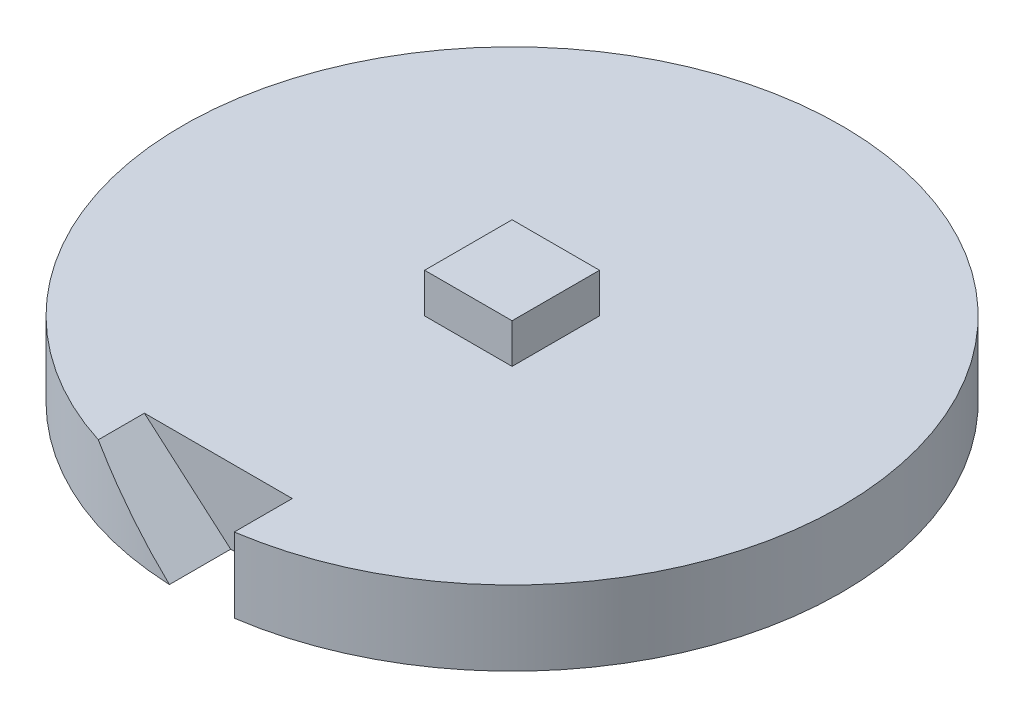
ISO-10303-21;
HEADER;
FILE_DESCRIPTION(('STEP AP214'),'2;1');
FILE_NAME('part.step','',(''),(''),'','','');
FILE_SCHEMA(('AUTOMOTIVE_DESIGN { 1 0 10303 214 1 1 1 1 }'));
ENDSEC;
DATA;
#1=APPLICATION_CONTEXT('core data for automotive mechanical design processes');
#2=APPLICATION_PROTOCOL_DEFINITION('international standard','automotive_design',2000,#1);
#3=PRODUCT_CONTEXT('',#1,'mechanical');
#4=PRODUCT('Part','Part','',(#3));
#5=PRODUCT_RELATED_PRODUCT_CATEGORY('part','',(#4));
#6=PRODUCT_DEFINITION_FORMATION('','',#4);
#7=PRODUCT_DEFINITION_CONTEXT('part definition',#1,'design');
#8=PRODUCT_DEFINITION('design','',#6,#7);
#9=PRODUCT_DEFINITION_SHAPE('','',#8);
#10=(LENGTH_UNIT() NAMED_UNIT(*) SI_UNIT(.MILLI.,.METRE.));
#11=(NAMED_UNIT(*) PLANE_ANGLE_UNIT() SI_UNIT($,.RADIAN.));
#12=(NAMED_UNIT(*) SI_UNIT($,.STERADIAN.) SOLID_ANGLE_UNIT());
#13=UNCERTAINTY_MEASURE_WITH_UNIT(LENGTH_MEASURE(1.E-05),#10,'distance_accuracy_value','');
#14=(GEOMETRIC_REPRESENTATION_CONTEXT(3) GLOBAL_UNCERTAINTY_ASSIGNED_CONTEXT((#13)) GLOBAL_UNIT_ASSIGNED_CONTEXT((#10,
#11,#12)) REPRESENTATION_CONTEXT('',''));
#15=CARTESIAN_POINT('',(0.,0.,0.));
#16=DIRECTION('',(0.,0.,1.));
#17=DIRECTION('',(1.,0.,0.));
#18=AXIS2_PLACEMENT_3D('',#15,#16,#17);
#19=CARTESIAN_POINT('',(0.,8.5,0.));
#20=DIRECTION('',(0.,1.,0.));
#21=DIRECTION('',(0.,0.,1.));
#22=AXIS2_PLACEMENT_3D('',#19,#20,#21);
#23=PLANE('',#22);
#24=DIRECTION('',(0.,0.,1.));
#25=VECTOR('',#24,1.);
#26=CARTESIAN_POINT('',(-11.3352998065365,8.5,30.5));
#27=LINE('',#26,#25);
#28=CARTESIAN_POINT('',(-11.3352998065365,8.5,30.5));
#29=VERTEX_POINT('',#28);
#30=CARTESIAN_POINT('',(-11.3352998065365,8.5,35.7457826644757));
#31=VERTEX_POINT('',#30);
#32=EDGE_CURVE('E142',#29,#31,#27,.T.);
#33=ORIENTED_EDGE('',*,*,#32,.F.);
#34=DIRECTION('',(-1.,0.,0.));
#35=VECTOR('',#34,1.);
#36=CARTESIAN_POINT('',(5.48783229101683,8.5,30.5));
#37=LINE('',#36,#35);
#38=CARTESIAN_POINT('',(5.48783229101683,8.5,30.5));
#39=VERTEX_POINT('',#38);
#40=EDGE_CURVE('E126',#39,#29,#37,.T.);
#41=ORIENTED_EDGE('',*,*,#40,.F.);
#42=DIRECTION('',(0.,0.,1.));
#43=VECTOR('',#42,1.);
#44=CARTESIAN_POINT('',(5.48783229101683,8.5,30.5));
#45=LINE('',#44,#43);
#46=CARTESIAN_POINT('',(5.48783229101683,8.5,37.0962760495669));
#47=VERTEX_POINT('',#46);
#48=EDGE_CURVE('E134',#39,#47,#45,.T.);
#49=ORIENTED_EDGE('',*,*,#48,.T.);
#50=CARTESIAN_POINT('',(0.,8.5,0.));
#51=DIRECTION('',(0.,1.,0.));
#52=DIRECTION('',(0.,0.,1.));
#53=AXIS2_PLACEMENT_3D('',#50,#51,#52);
#54=CIRCLE('',#53,37.5);
#55=EDGE_CURVE('E227',#47,#31,#54,.T.);
#56=ORIENTED_EDGE('',*,*,#55,.T.);
#57=EDGE_LOOP('',(#33,#41,#49,#56));
#58=FACE_BOUND('',#57,.T.);
#59=DIRECTION('',(1.,0.,0.));
#60=VECTOR('',#59,1.);
#61=CARTESIAN_POINT('',(0.,8.5,-4.975));
#62=LINE('',#61,#60);
#63=CARTESIAN_POINT('',(-4.975,8.5,-4.975));
#64=VERTEX_POINT('',#63);
#65=CARTESIAN_POINT('',(4.975,8.5,-4.975));
#66=VERTEX_POINT('',#65);
#67=EDGE_CURVE('E218',#64,#66,#62,.T.);
#68=ORIENTED_EDGE('',*,*,#67,.T.);
#69=DIRECTION('',(0.,0.,1.));
#70=VECTOR('',#69,1.);
#71=CARTESIAN_POINT('',(4.975,8.5,0.));
#72=LINE('',#71,#70);
#73=CARTESIAN_POINT('',(4.975,8.5,4.975));
#74=VERTEX_POINT('',#73);
#75=EDGE_CURVE('E222',#66,#74,#72,.T.);
#76=ORIENTED_EDGE('',*,*,#75,.T.);
#77=DIRECTION('',(-1.,0.,0.));
#78=VECTOR('',#77,1.);
#79=CARTESIAN_POINT('',(0.,8.5,4.975));
#80=LINE('',#79,#78);
#81=CARTESIAN_POINT('',(-4.975,8.5,4.975));
#82=VERTEX_POINT('',#81);
#83=EDGE_CURVE('E210',#74,#82,#80,.T.);
#84=ORIENTED_EDGE('',*,*,#83,.T.);
#85=DIRECTION('',(0.,0.,-1.));
#86=VECTOR('',#85,1.);
#87=CARTESIAN_POINT('',(-4.975,8.5,0.));
#88=LINE('',#87,#86);
#89=EDGE_CURVE('E214',#82,#64,#88,.T.);
#90=ORIENTED_EDGE('',*,*,#89,.T.);
#91=EDGE_LOOP('',(#68,#76,#84,#90));
#92=FACE_BOUND('',#91,.T.);
#93=ADVANCED_FACE('F45',(#58,#92),#23,.T.);
#94=CARTESIAN_POINT('',(0.,8.5,0.));
#95=DIRECTION('',(0.,-1.,0.));
#96=DIRECTION('',(0.,0.,-1.));
#97=AXIS2_PLACEMENT_3D('',#94,#95,#96);
#98=CYLINDRICAL_SURFACE('',#97,37.5);
#99=CARTESIAN_POINT('',(0.,0.,0.));
#100=DIRECTION('',(0.,1.,0.));
#101=DIRECTION('',(0.,0.,1.));
#102=AXIS2_PLACEMENT_3D('',#99,#100,#101);
#103=CIRCLE('',#102,37.5);
#104=CARTESIAN_POINT('',(5.48783229101683,0.,37.0962760495669));
#105=VERTEX_POINT('',#104);
#106=CARTESIAN_POINT('',(-1.51899802399232,0.,37.4692226367603));
#107=VERTEX_POINT('',#106);
#108=EDGE_CURVE('E226',#105,#107,#103,.T.);
#109=ORIENTED_EDGE('',*,*,#108,.T.);
#110=CARTESIAN_POINT('',(0.,-1.315310336821,0.));
#111=DIRECTION('',(-0.654602325716553,-0.755973409033995,0.));
#112=DIRECTION('',(0.755973409033995,-0.654602325716553,0.));
#113=AXIS2_PLACEMENT_3D('',#110,#111,#112);
#114=ELLIPSE('',#113,49.6049193686834,37.5);
#115=EDGE_CURVE('E155',#107,#31,#114,.T.);
#116=ORIENTED_EDGE('',*,*,#115,.T.);
#117=ORIENTED_EDGE('',*,*,#55,.F.);
#118=DIRECTION('',(0.,-1.,0.));
#119=VECTOR('',#118,1.);
#120=CARTESIAN_POINT('',(5.48783229101683,8.5,37.0962760495669));
#121=LINE('',#120,#119);
#122=EDGE_CURVE('E137',#47,#105,#121,.T.);
#123=ORIENTED_EDGE('',*,*,#122,.T.);
#124=EDGE_LOOP('',(#109,#116,#117,#123));
#125=FACE_BOUND('',#124,.T.);
#126=ADVANCED_FACE('F47',(#125),#98,.T.);
#127=CARTESIAN_POINT('',(0.,0.,0.));
#128=DIRECTION('',(0.,1.,0.));
#129=DIRECTION('',(0.,0.,1.));
#130=AXIS2_PLACEMENT_3D('',#127,#128,#129);
#131=PLANE('',#130);
#132=CARTESIAN_POINT('',(0.,0.,0.));
#133=DIRECTION('',(0.,1.,0.));
#134=DIRECTION('',(0.,0.,1.));
#135=AXIS2_PLACEMENT_3D('',#132,#133,#134);
#136=CIRCLE('',#135,5.);
#137=CARTESIAN_POINT('',(0.,0.,5.));
#138=VERTEX_POINT('',#137);
#139=EDGE_CURVE('E230',#138,#138,#136,.F.);
#140=ORIENTED_EDGE('',*,*,#139,.F.);
#141=EDGE_LOOP('',(#140));
#142=FACE_BOUND('',#141,.T.);
#143=DIRECTION('',(1.,0.,0.));
#144=VECTOR('',#143,1.);
#145=CARTESIAN_POINT('',(0.,0.,30.5));
#146=LINE('',#145,#144);
#147=CARTESIAN_POINT('',(-1.51899802399232,0.,30.5));
#148=VERTEX_POINT('',#147);
#149=CARTESIAN_POINT('',(5.48783229101683,0.,30.5));
#150=VERTEX_POINT('',#149);
#151=EDGE_CURVE('E128',#148,#150,#146,.T.);
#152=ORIENTED_EDGE('',*,*,#151,.F.);
#153=DIRECTION('',(0.,0.,1.));
#154=VECTOR('',#153,1.);
#155=CARTESIAN_POINT('',(-1.51899802399232,0.,0.));
#156=LINE('',#155,#154);
#157=EDGE_CURVE('E11',#148,#107,#156,.T.);
#158=ORIENTED_EDGE('',*,*,#157,.T.);
#159=ORIENTED_EDGE('',*,*,#108,.F.);
#160=DIRECTION('',(0.,0.,-1.));
#161=VECTOR('',#160,1.);
#162=CARTESIAN_POINT('',(5.48783229101683,0.,0.));
#163=LINE('',#162,#161);
#164=EDGE_CURVE('E54',#105,#150,#163,.T.);
#165=ORIENTED_EDGE('',*,*,#164,.T.);
#166=EDGE_LOOP('',(#152,#158,#159,#165));
#167=FACE_BOUND('',#166,.T.);
#168=ADVANCED_FACE('F241',(#142,#167),#131,.F.);
#169=CARTESIAN_POINT('',(4.975,13.,-4.975));
#170=DIRECTION('',(-1.,0.,0.));
#171=DIRECTION('',(0.,0.,1.));
#172=AXIS2_PLACEMENT_3D('',#169,#170,#171);
#173=PLANE('',#172);
#174=ORIENTED_EDGE('',*,*,#75,.F.);
#175=DIRECTION('',(0.,-1.,0.));
#176=VECTOR('',#175,1.);
#177=CARTESIAN_POINT('',(4.975,13.,-4.975));
#178=LINE('',#177,#176);
#179=CARTESIAN_POINT('',(4.975,13.,-4.975));
#180=VERTEX_POINT('',#179);
#181=EDGE_CURVE('E206',#180,#66,#178,.T.);
#182=ORIENTED_EDGE('',*,*,#181,.F.);
#183=DIRECTION('',(0.,0.,-1.));
#184=VECTOR('',#183,1.);
#185=CARTESIAN_POINT('',(4.975,13.,-4.975));
#186=LINE('',#185,#184);
#187=CARTESIAN_POINT('',(4.975,13.,4.975));
#188=VERTEX_POINT('',#187);
#189=EDGE_CURVE('E182',#188,#180,#186,.T.);
#190=ORIENTED_EDGE('',*,*,#189,.F.);
#191=DIRECTION('',(0.,-1.,0.));
#192=VECTOR('',#191,1.);
#193=CARTESIAN_POINT('',(4.975,13.,4.975));
#194=LINE('',#193,#192);
#195=EDGE_CURVE('E195',#188,#74,#194,.T.);
#196=ORIENTED_EDGE('',*,*,#195,.T.);
#197=EDGE_LOOP('',(#174,#182,#190,#196));
#198=FACE_BOUND('',#197,.T.);
#199=ADVANCED_FACE('F264',(#198),#173,.F.);
#200=CARTESIAN_POINT('',(-4.975,13.,-4.975));
#201=DIRECTION('',(0.,0.,1.));
#202=DIRECTION('',(1.,0.,0.));
#203=AXIS2_PLACEMENT_3D('',#200,#201,#202);
#204=PLANE('',#203);
#205=ORIENTED_EDGE('',*,*,#67,.F.);
#206=DIRECTION('',(0.,-1.,0.));
#207=VECTOR('',#206,1.);
#208=CARTESIAN_POINT('',(-4.975,13.,-4.975));
#209=LINE('',#208,#207);
#210=CARTESIAN_POINT('',(-4.975,13.,-4.975));
#211=VERTEX_POINT('',#210);
#212=EDGE_CURVE('E202',#211,#64,#209,.T.);
#213=ORIENTED_EDGE('',*,*,#212,.F.);
#214=DIRECTION('',(-1.,0.,0.));
#215=VECTOR('',#214,1.);
#216=CARTESIAN_POINT('',(-4.975,13.,-4.975));
#217=LINE('',#216,#215);
#218=EDGE_CURVE('E186',#180,#211,#217,.T.);
#219=ORIENTED_EDGE('',*,*,#218,.F.);
#220=ORIENTED_EDGE('',*,*,#181,.T.);
#221=EDGE_LOOP('',(#205,#213,#219,#220));
#222=FACE_BOUND('',#221,.T.);
#223=ADVANCED_FACE('F270',(#222),#204,.F.);
#224=CARTESIAN_POINT('',(-4.975,13.,-4.975));
#225=DIRECTION('',(1.,0.,0.));
#226=DIRECTION('',(0.,0.,-1.));
#227=AXIS2_PLACEMENT_3D('',#224,#225,#226);
#228=PLANE('',#227);
#229=ORIENTED_EDGE('',*,*,#89,.F.);
#230=DIRECTION('',(0.,-1.,0.));
#231=VECTOR('',#230,1.);
#232=CARTESIAN_POINT('',(-4.975,13.,4.975));
#233=LINE('',#232,#231);
#234=CARTESIAN_POINT('',(-4.975,13.,4.975));
#235=VERTEX_POINT('',#234);
#236=EDGE_CURVE('E199',#235,#82,#233,.T.);
#237=ORIENTED_EDGE('',*,*,#236,.F.);
#238=DIRECTION('',(0.,0.,1.));
#239=VECTOR('',#238,1.);
#240=CARTESIAN_POINT('',(-4.975,13.,-4.975));
#241=LINE('',#240,#239);
#242=EDGE_CURVE('E189',#211,#235,#241,.T.);
#243=ORIENTED_EDGE('',*,*,#242,.F.);
#244=ORIENTED_EDGE('',*,*,#212,.T.);
#245=EDGE_LOOP('',(#229,#237,#243,#244));
#246=FACE_BOUND('',#245,.T.);
#247=ADVANCED_FACE('F295',(#246),#228,.F.);
#248=CARTESIAN_POINT('',(-4.975,13.,4.975));
#249=DIRECTION('',(0.,0.,-1.));
#250=DIRECTION('',(-1.,0.,0.));
#251=AXIS2_PLACEMENT_3D('',#248,#249,#250);
#252=PLANE('',#251);
#253=ORIENTED_EDGE('',*,*,#83,.F.);
#254=ORIENTED_EDGE('',*,*,#195,.F.);
#255=DIRECTION('',(1.,0.,0.));
#256=VECTOR('',#255,1.);
#257=CARTESIAN_POINT('',(-4.975,13.,4.975));
#258=LINE('',#257,#256);
#259=EDGE_CURVE('E192',#235,#188,#258,.T.);
#260=ORIENTED_EDGE('',*,*,#259,.F.);
#261=ORIENTED_EDGE('',*,*,#236,.T.);
#262=EDGE_LOOP('',(#253,#254,#260,#261));
#263=FACE_BOUND('',#262,.T.);
#264=ADVANCED_FACE('F287',(#263),#252,.F.);
#265=CARTESIAN_POINT('',(0.,13.,0.));
#266=DIRECTION('',(0.,1.,0.));
#267=DIRECTION('',(0.,0.,1.));
#268=AXIS2_PLACEMENT_3D('',#265,#266,#267);
#269=PLANE('',#268);
#270=ORIENTED_EDGE('',*,*,#189,.T.);
#271=ORIENTED_EDGE('',*,*,#218,.T.);
#272=ORIENTED_EDGE('',*,*,#242,.T.);
#273=ORIENTED_EDGE('',*,*,#259,.T.);
#274=EDGE_LOOP('',(#270,#271,#272,#273));
#275=FACE_BOUND('',#274,.T.);
#276=ADVANCED_FACE('F277',(#275),#269,.T.);
#277=CARTESIAN_POINT('',(0.,-10.,0.));
#278=DIRECTION('',(0.,1.,0.));
#279=DIRECTION('',(0.,0.,1.));
#280=AXIS2_PLACEMENT_3D('',#277,#278,#279);
#281=CYLINDRICAL_SURFACE('',#280,5.);
#282=CARTESIAN_POINT('',(0.,-10.,0.));
#283=DIRECTION('',(0.,-1.,0.));
#284=DIRECTION('',(0.,0.,-1.));
#285=AXIS2_PLACEMENT_3D('',#282,#283,#284);
#286=CIRCLE('',#285,5.);
#287=CARTESIAN_POINT('',(0.,-10.,-5.));
#288=VERTEX_POINT('',#287);
#289=EDGE_CURVE('E178',#288,#288,#286,.T.);
#290=ORIENTED_EDGE('',*,*,#289,.F.);
#291=EDGE_LOOP('',(#290));
#292=FACE_BOUND('',#291,.T.);
#293=ORIENTED_EDGE('',*,*,#139,.T.);
#294=EDGE_LOOP('',(#293));
#295=FACE_BOUND('',#294,.T.);
#296=ADVANCED_FACE('F274',(#292,#295),#281,.T.);
#297=CARTESIAN_POINT('',(0.,-10.,0.));
#298=DIRECTION('',(0.,-1.,0.));
#299=DIRECTION('',(0.,0.,-1.));
#300=AXIS2_PLACEMENT_3D('',#297,#298,#299);
#301=PLANE('',#300);
#302=CARTESIAN_POINT('',(0.0180115311504414,-10.,0.00676759727533257));
#303=DIRECTION('',(0.,-1.,0.));
#304=DIRECTION('',(0.,0.,-1.));
#305=AXIS2_PLACEMENT_3D('',#302,#303,#304);
#306=CIRCLE('',#305,1.55);
#307=CARTESIAN_POINT('',(0.565734088655607,-10.,-1.44323240272467));
#308=VERTEX_POINT('',#307);
#309=CARTESIAN_POINT('',(-0.529711026354725,-10.,-1.44323240272467));
#310=VERTEX_POINT('',#309);
#311=EDGE_CURVE('E69',#308,#310,#306,.T.);
#312=ORIENTED_EDGE('',*,*,#311,.F.);
#313=DIRECTION('',(1.,0.,0.));
#314=VECTOR('',#313,1.);
#315=CARTESIAN_POINT('',(0.0180115311504414,-10.,-1.44323240272467));
#316=LINE('',#315,#314);
#317=EDGE_CURVE('E163',#310,#308,#316,.T.);
#318=ORIENTED_EDGE('',*,*,#317,.F.);
#319=EDGE_LOOP('',(#312,#318));
#320=FACE_BOUND('',#319,.T.);
#321=ORIENTED_EDGE('',*,*,#289,.T.);
#322=EDGE_LOOP('',(#321));
#323=FACE_BOUND('',#322,.T.);
#324=ADVANCED_FACE('F276',(#320,#323),#301,.T.);
#325=CARTESIAN_POINT('',(0.0180115311504414,0.,0.00676759727533257));
#326=DIRECTION('',(0.,-1.,0.));
#327=DIRECTION('',(0.,0.,-1.));
#328=AXIS2_PLACEMENT_3D('',#325,#326,#327);
#329=CYLINDRICAL_SURFACE('',#328,1.55);
#330=ORIENTED_EDGE('',*,*,#311,.T.);
#331=DIRECTION('',(0.,-1.,0.));
#332=VECTOR('',#331,1.);
#333=CARTESIAN_POINT('',(-0.529711026354725,0.,-1.44323240272467));
#334=LINE('',#333,#332);
#335=CARTESIAN_POINT('',(-0.529711026354725,0.,-1.44323240272467));
#336=VERTEX_POINT('',#335);
#337=EDGE_CURVE('E175',#336,#310,#334,.T.);
#338=ORIENTED_EDGE('',*,*,#337,.F.);
#339=CARTESIAN_POINT('',(0.0180115311504414,0.,0.00676759727533257));
#340=DIRECTION('',(0.,-1.,0.));
#341=DIRECTION('',(0.,0.,-1.));
#342=AXIS2_PLACEMENT_3D('',#339,#340,#341);
#343=CIRCLE('',#342,1.55);
#344=CARTESIAN_POINT('',(0.565734088655607,0.,-1.44323240272467));
#345=VERTEX_POINT('',#344);
#346=EDGE_CURVE('E162',#345,#336,#343,.T.);
#347=ORIENTED_EDGE('',*,*,#346,.F.);
#348=DIRECTION('',(0.,-1.,0.));
#349=VECTOR('',#348,1.);
#350=CARTESIAN_POINT('',(0.565734088655607,0.,-1.44323240272467));
#351=LINE('',#350,#349);
#352=EDGE_CURVE('E167',#345,#308,#351,.T.);
#353=ORIENTED_EDGE('',*,*,#352,.T.);
#354=EDGE_LOOP('',(#330,#338,#347,#353));
#355=FACE_BOUND('',#354,.T.);
#356=ADVANCED_FACE('F284',(#355),#329,.F.);
#357=CARTESIAN_POINT('',(0.0180115311504414,0.,-1.44323240272467));
#358=DIRECTION('',(0.,0.,-1.));
#359=DIRECTION('',(-1.,0.,0.));
#360=AXIS2_PLACEMENT_3D('',#357,#358,#359);
#361=PLANE('',#360);
#362=ORIENTED_EDGE('',*,*,#317,.T.);
#363=ORIENTED_EDGE('',*,*,#352,.F.);
#364=DIRECTION('',(-1.,0.,0.));
#365=VECTOR('',#364,1.);
#366=CARTESIAN_POINT('',(0.0180115311504414,0.,-1.44323240272467));
#367=LINE('',#366,#365);
#368=EDGE_CURVE('E159',#345,#336,#367,.T.);
#369=ORIENTED_EDGE('',*,*,#368,.T.);
#370=ORIENTED_EDGE('',*,*,#337,.T.);
#371=EDGE_LOOP('',(#362,#363,#369,#370));
#372=FACE_BOUND('',#371,.T.);
#373=ADVANCED_FACE('F254',(#372),#361,.F.);
#374=CARTESIAN_POINT('',(0.0180115311504414,0.,0.00676759727533257));
#375=DIRECTION('',(0.,-1.,0.));
#376=DIRECTION('',(0.,0.,-1.));
#377=AXIS2_PLACEMENT_3D('',#374,#375,#376);
#378=PLANE('',#377);
#379=ORIENTED_EDGE('',*,*,#368,.F.);
#380=ORIENTED_EDGE('',*,*,#346,.T.);
#381=EDGE_LOOP('',(#379,#380));
#382=FACE_BOUND('',#381,.T.);
#383=ADVANCED_FACE('F246',(#382),#378,.T.);
#384=CARTESIAN_POINT('',(-1.47940977066769,-0.0342797278153948,30.5));
#385=DIRECTION('',(-0.654602325716553,-0.755973409033995,0.));
#386=DIRECTION('',(0.755973409033995,-0.654602325716553,0.));
#387=AXIS2_PLACEMENT_3D('',#384,#385,#386);
#388=PLANE('',#387);
#389=ORIENTED_EDGE('',*,*,#157,.F.);
#390=DIRECTION('',(0.755973409033995,-0.654602325716553,0.));
#391=VECTOR('',#390,1.);
#392=CARTESIAN_POINT('',(-1.47940977066769,-0.0342797278153948,30.5));
#393=LINE('',#392,#391);
#394=EDGE_CURVE('E61',#29,#148,#393,.T.);
#395=ORIENTED_EDGE('',*,*,#394,.F.);
#396=ORIENTED_EDGE('',*,*,#32,.T.);
#397=ORIENTED_EDGE('',*,*,#115,.F.);
#398=EDGE_LOOP('',(#389,#395,#396,#397));
#399=FACE_BOUND('',#398,.T.);
#400=ADVANCED_FACE('F244',(#399),#388,.F.);
#401=CARTESIAN_POINT('',(5.48783229101683,5.96572027218461,30.5));
#402=DIRECTION('',(1.,0.,0.));
#403=DIRECTION('',(0.,0.,-1.));
#404=AXIS2_PLACEMENT_3D('',#401,#402,#403);
#405=PLANE('',#404);
#406=ORIENTED_EDGE('',*,*,#48,.F.);
#407=DIRECTION('',(0.,1.,0.));
#408=VECTOR('',#407,1.);
#409=CARTESIAN_POINT('',(5.48783229101683,-0.0342797278153948,30.5));
#410=LINE('',#409,#408);
#411=EDGE_CURVE('E122',#150,#39,#410,.T.);
#412=ORIENTED_EDGE('',*,*,#411,.F.);
#413=ORIENTED_EDGE('',*,*,#164,.F.);
#414=ORIENTED_EDGE('',*,*,#122,.F.);
#415=EDGE_LOOP('',(#406,#412,#413,#414));
#416=FACE_BOUND('',#415,.T.);
#417=ADVANCED_FACE('F135',(#416),#405,.F.);
#418=CARTESIAN_POINT('',(0.,0.,30.5));
#419=DIRECTION('',(0.,0.,1.));
#420=DIRECTION('',(1.,0.,0.));
#421=AXIS2_PLACEMENT_3D('',#418,#419,#420);
#422=PLANE('',#421);
#423=ORIENTED_EDGE('',*,*,#151,.T.);
#424=ORIENTED_EDGE('',*,*,#411,.T.);
#425=ORIENTED_EDGE('',*,*,#40,.T.);
#426=ORIENTED_EDGE('',*,*,#394,.T.);
#427=EDGE_LOOP('',(#423,#424,#425,#426));
#428=FACE_BOUND('',#427,.T.);
#429=ADVANCED_FACE('F124',(#428),#422,.T.);
#430=CLOSED_SHELL('',(#93,#126,#168,#199,#223,#247,#264,#276,#296,#324,#356,#373,#383,#400,#417,#429));
#431=MANIFOLD_SOLID_BREP('B2',#430);
#432=ADVANCED_BREP_SHAPE_REPRESENTATION('',(#18,#431),#14);
#433=SHAPE_DEFINITION_REPRESENTATION(#9,#432);
ENDSEC;
END-ISO-10303-21;
